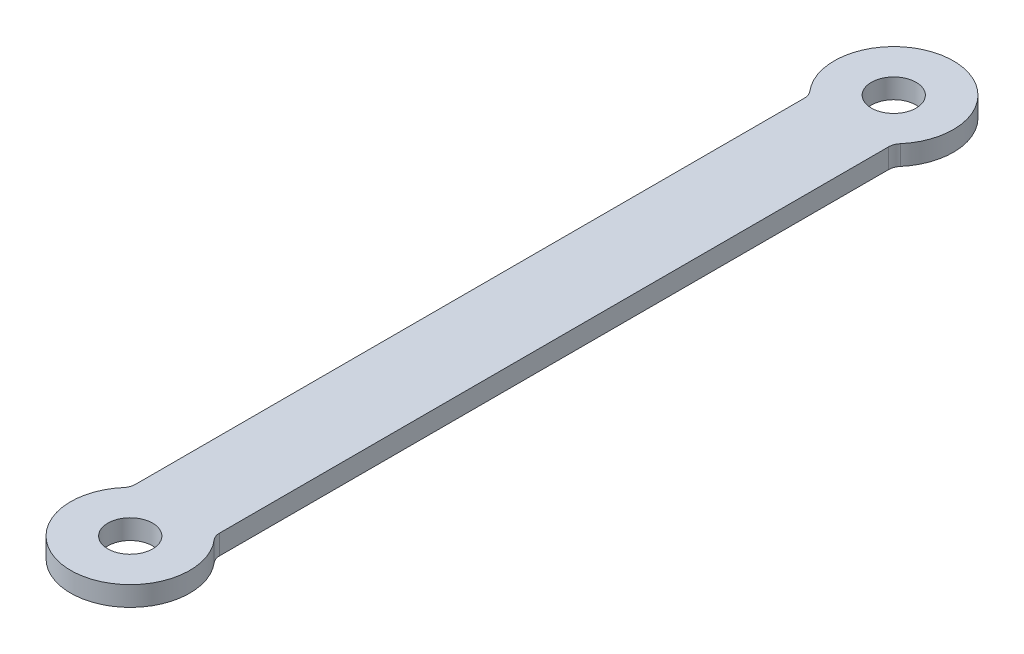
ISO-10303-21;
HEADER;
FILE_DESCRIPTION(('STEP AP214'),'2;1');
FILE_NAME('part.step','',(''),(''),'','','');
FILE_SCHEMA(('AUTOMOTIVE_DESIGN { 1 0 10303 214 1 1 1 1 }'));
ENDSEC;
DATA;
#1=APPLICATION_CONTEXT('core data for automotive mechanical design processes');
#2=APPLICATION_PROTOCOL_DEFINITION('international standard','automotive_design',2000,#1);
#3=PRODUCT_CONTEXT('',#1,'mechanical');
#4=PRODUCT('Part','Part','',(#3));
#5=PRODUCT_RELATED_PRODUCT_CATEGORY('part','',(#4));
#6=PRODUCT_DEFINITION_FORMATION('','',#4);
#7=PRODUCT_DEFINITION_CONTEXT('part definition',#1,'design');
#8=PRODUCT_DEFINITION('design','',#6,#7);
#9=PRODUCT_DEFINITION_SHAPE('','',#8);
#10=(LENGTH_UNIT() NAMED_UNIT(*) SI_UNIT(.MILLI.,.METRE.));
#11=(NAMED_UNIT(*) PLANE_ANGLE_UNIT() SI_UNIT($,.RADIAN.));
#12=(NAMED_UNIT(*) SI_UNIT($,.STERADIAN.) SOLID_ANGLE_UNIT());
#13=UNCERTAINTY_MEASURE_WITH_UNIT(LENGTH_MEASURE(1.E-05),#10,'distance_accuracy_value','');
#14=(GEOMETRIC_REPRESENTATION_CONTEXT(3) GLOBAL_UNCERTAINTY_ASSIGNED_CONTEXT((#13)) GLOBAL_UNIT_ASSIGNED_CONTEXT((#10,
#11,#12)) REPRESENTATION_CONTEXT('',''));
#15=CARTESIAN_POINT('',(0.,0.,0.));
#16=DIRECTION('',(0.,0.,1.));
#17=DIRECTION('',(1.,0.,0.));
#18=AXIS2_PLACEMENT_3D('',#15,#16,#17);
#19=CARTESIAN_POINT('',(0.,1.5,29.));
#20=DIRECTION('',(0.,-1.,0.));
#21=DIRECTION('',(0.,0.,-1.));
#22=AXIS2_PLACEMENT_3D('',#19,#20,#21);
#23=CYLINDRICAL_SURFACE('',#22,4.525);
#24=CARTESIAN_POINT('',(0.,1.5,29.));
#25=DIRECTION('',(0.,1.,0.));
#26=DIRECTION('',(0.,0.,1.));
#27=AXIS2_PLACEMENT_3D('',#24,#25,#26);
#28=CIRCLE('',#27,4.525);
#29=CARTESIAN_POINT('',(-3.43953905638603,1.5,26.0597285704216));
#30=VERTEX_POINT('',#29);
#31=CARTESIAN_POINT('',(3.43953905638603,1.5,26.0597285704216));
#32=VERTEX_POINT('',#31);
#33=EDGE_CURVE('E134',#30,#32,#28,.T.);
#34=ORIENTED_EDGE('',*,*,#33,.F.);
#35=DIRECTION('',(0.,-1.,0.));
#36=VECTOR('',#35,1.);
#37=CARTESIAN_POINT('',(-3.43953905638603,1.5,26.0597285704216));
#38=LINE('',#37,#36);
#39=CARTESIAN_POINT('',(-3.43953905638603,0.,26.0597285704216));
#40=VERTEX_POINT('',#39);
#41=EDGE_CURVE('E149',#30,#40,#38,.T.);
#42=ORIENTED_EDGE('',*,*,#41,.T.);
#43=CARTESIAN_POINT('',(0.,0.,29.));
#44=DIRECTION('',(0.,1.,0.));
#45=DIRECTION('',(0.,0.,1.));
#46=AXIS2_PLACEMENT_3D('',#43,#44,#45);
#47=CIRCLE('',#46,4.525);
#48=CARTESIAN_POINT('',(3.43953905638603,0.,26.0597285704216));
#49=VERTEX_POINT('',#48);
#50=EDGE_CURVE('E166',#40,#49,#47,.T.);
#51=ORIENTED_EDGE('',*,*,#50,.T.);
#52=DIRECTION('',(0.,-1.,0.));
#53=VECTOR('',#52,1.);
#54=CARTESIAN_POINT('',(3.43953905638603,1.5,26.0597285704216));
#55=LINE('',#54,#53);
#56=EDGE_CURVE('E147',#49,#32,#55,.F.);
#57=ORIENTED_EDGE('',*,*,#56,.T.);
#58=EDGE_LOOP('',(#34,#42,#51,#57));
#59=FACE_BOUND('',#58,.T.);
#60=ADVANCED_FACE('F41',(#59),#23,.T.);
#61=CARTESIAN_POINT('',(3.19965818486913,1.5,0.));
#62=DIRECTION('',(1.,0.,0.));
#63=DIRECTION('',(0.,0.,-1.));
#64=AXIS2_PLACEMENT_3D('',#61,#62,#63);
#65=PLANE('',#64);
#66=DIRECTION('',(0.,0.,1.));
#67=VECTOR('',#66,1.);
#68=CARTESIAN_POINT('',(3.19965818486913,1.5,0.));
#69=LINE('',#68,#67);
#70=CARTESIAN_POINT('',(3.19965818486913,1.5,-25.4099448290783));
#71=VERTEX_POINT('',#70);
#72=CARTESIAN_POINT('',(3.19965818486914,1.5,25.4099448290783));
#73=VERTEX_POINT('',#72);
#74=EDGE_CURVE('E137',#71,#73,#69,.T.);
#75=ORIENTED_EDGE('',*,*,#74,.T.);
#76=DIRECTION('',(0.,-1.,0.));
#77=VECTOR('',#76,1.);
#78=CARTESIAN_POINT('',(3.19965818486914,1.5,25.4099448290783));
#79=LINE('',#78,#77);
#80=CARTESIAN_POINT('',(3.19965818486914,0.,25.4099448290783));
#81=VERTEX_POINT('',#80);
#82=EDGE_CURVE('E118',#73,#81,#79,.T.);
#83=ORIENTED_EDGE('',*,*,#82,.T.);
#84=DIRECTION('',(0.,0.,1.));
#85=VECTOR('',#84,1.);
#86=CARTESIAN_POINT('',(3.19965818486913,0.,0.));
#87=LINE('',#86,#85);
#88=CARTESIAN_POINT('',(3.19965818486913,0.,-25.4099448290783));
#89=VERTEX_POINT('',#88);
#90=EDGE_CURVE('E139',#89,#81,#87,.T.);
#91=ORIENTED_EDGE('',*,*,#90,.F.);
#92=DIRECTION('',(0.,-1.,0.));
#93=VECTOR('',#92,1.);
#94=CARTESIAN_POINT('',(3.19965818486913,1.5,-25.4099448290783));
#95=LINE('',#94,#93);
#96=EDGE_CURVE('E63',#89,#71,#95,.F.);
#97=ORIENTED_EDGE('',*,*,#96,.T.);
#98=EDGE_LOOP('',(#75,#83,#91,#97));
#99=FACE_BOUND('',#98,.T.);
#100=ADVANCED_FACE('F164',(#99),#65,.T.);
#101=CARTESIAN_POINT('',(0.,1.5,-29.));
#102=DIRECTION('',(0.,-1.,0.));
#103=DIRECTION('',(0.,0.,-1.));
#104=AXIS2_PLACEMENT_3D('',#101,#102,#103);
#105=CYLINDRICAL_SURFACE('',#104,4.525);
#106=CARTESIAN_POINT('',(0.,0.,-29.));
#107=DIRECTION('',(0.,1.,0.));
#108=DIRECTION('',(0.,0.,1.));
#109=AXIS2_PLACEMENT_3D('',#106,#107,#108);
#110=CIRCLE('',#109,4.525);
#111=CARTESIAN_POINT('',(3.43953905638603,0.,-26.0597285704216));
#112=VERTEX_POINT('',#111);
#113=CARTESIAN_POINT('',(-3.43953905638603,0.,-26.0597285704216));
#114=VERTEX_POINT('',#113);
#115=EDGE_CURVE('E135',#112,#114,#110,.T.);
#116=ORIENTED_EDGE('',*,*,#115,.T.);
#117=DIRECTION('',(0.,-1.,0.));
#118=VECTOR('',#117,1.);
#119=CARTESIAN_POINT('',(-3.43953905638603,1.5,-26.0597285704216));
#120=LINE('',#119,#118);
#121=CARTESIAN_POINT('',(-3.43953905638603,1.5,-26.0597285704216));
#122=VERTEX_POINT('',#121);
#123=EDGE_CURVE('E112',#114,#122,#120,.F.);
#124=ORIENTED_EDGE('',*,*,#123,.T.);
#125=CARTESIAN_POINT('',(0.,1.5,-29.));
#126=DIRECTION('',(0.,1.,0.));
#127=DIRECTION('',(0.,0.,1.));
#128=AXIS2_PLACEMENT_3D('',#125,#126,#127);
#129=CIRCLE('',#128,4.525);
#130=CARTESIAN_POINT('',(3.43953905638603,1.5,-26.0597285704216));
#131=VERTEX_POINT('',#130);
#132=EDGE_CURVE('E171',#131,#122,#129,.T.);
#133=ORIENTED_EDGE('',*,*,#132,.F.);
#134=DIRECTION('',(0.,-1.,0.));
#135=VECTOR('',#134,1.);
#136=CARTESIAN_POINT('',(3.43953905638603,1.5,-26.0597285704216));
#137=LINE('',#136,#135);
#138=EDGE_CURVE('E128',#131,#112,#137,.T.);
#139=ORIENTED_EDGE('',*,*,#138,.T.);
#140=EDGE_LOOP('',(#116,#124,#133,#139));
#141=FACE_BOUND('',#140,.T.);
#142=ADVANCED_FACE('F173',(#141),#105,.T.);
#143=CARTESIAN_POINT('',(-3.19965818486914,1.5,0.));
#144=DIRECTION('',(1.,0.,0.));
#145=DIRECTION('',(0.,0.,-1.));
#146=AXIS2_PLACEMENT_3D('',#143,#144,#145);
#147=PLANE('',#146);
#148=DIRECTION('',(0.,0.,1.));
#149=VECTOR('',#148,1.);
#150=CARTESIAN_POINT('',(-3.19965818486914,1.5,0.));
#151=LINE('',#150,#149);
#152=CARTESIAN_POINT('',(-3.19965818486914,1.5,-25.4099448290783));
#153=VERTEX_POINT('',#152);
#154=CARTESIAN_POINT('',(-3.19965818486914,1.5,25.4099448290783));
#155=VERTEX_POINT('',#154);
#156=EDGE_CURVE('E127',#153,#155,#151,.T.);
#157=ORIENTED_EDGE('',*,*,#156,.F.);
#158=DIRECTION('',(0.,1.,0.));
#159=VECTOR('',#158,1.);
#160=CARTESIAN_POINT('',(-3.19965818486914,0.,-25.4099448290783));
#161=LINE('',#160,#159);
#162=CARTESIAN_POINT('',(-3.19965818486914,0.,-25.4099448290783));
#163=VERTEX_POINT('',#162);
#164=EDGE_CURVE('E111',#153,#163,#161,.F.);
#165=ORIENTED_EDGE('',*,*,#164,.T.);
#166=DIRECTION('',(0.,0.,1.));
#167=VECTOR('',#166,1.);
#168=CARTESIAN_POINT('',(-3.19965818486914,0.,0.));
#169=LINE('',#168,#167);
#170=CARTESIAN_POINT('',(-3.19965818486914,0.,25.4099448290783));
#171=VERTEX_POINT('',#170);
#172=EDGE_CURVE('E124',#163,#171,#169,.T.);
#173=ORIENTED_EDGE('',*,*,#172,.T.);
#174=DIRECTION('',(0.,1.,0.));
#175=VECTOR('',#174,1.);
#176=CARTESIAN_POINT('',(-3.19965818486914,1.5,25.4099448290783));
#177=LINE('',#176,#175);
#178=EDGE_CURVE('E129',#171,#155,#177,.T.);
#179=ORIENTED_EDGE('',*,*,#178,.T.);
#180=EDGE_LOOP('',(#157,#165,#173,#179));
#181=FACE_BOUND('',#180,.T.);
#182=ADVANCED_FACE('F123',(#181),#147,.F.);
#183=CARTESIAN_POINT('',(0.,1.5,0.));
#184=DIRECTION('',(0.,1.,0.));
#185=DIRECTION('',(0.,0.,1.));
#186=AXIS2_PLACEMENT_3D('',#183,#184,#185);
#187=PLANE('',#186);
#188=CARTESIAN_POINT('',(0.,1.5,-29.));
#189=DIRECTION('',(0.,1.,0.));
#190=DIRECTION('',(0.,0.,1.));
#191=AXIS2_PLACEMENT_3D('',#188,#189,#190);
#192=CIRCLE('',#191,1.7);
#193=CARTESIAN_POINT('',(0.,1.5,-27.3));
#194=VERTEX_POINT('',#193);
#195=EDGE_CURVE('E193',#194,#194,#192,.T.);
#196=ORIENTED_EDGE('',*,*,#195,.F.);
#197=EDGE_LOOP('',(#196));
#198=FACE_BOUND('',#197,.T.);
#199=CARTESIAN_POINT('',(0.,1.5,29.));
#200=DIRECTION('',(0.,1.,0.));
#201=DIRECTION('',(0.,0.,1.));
#202=AXIS2_PLACEMENT_3D('',#199,#200,#201);
#203=CIRCLE('',#202,1.7);
#204=CARTESIAN_POINT('',(0.,1.5,30.7));
#205=VERTEX_POINT('',#204);
#206=EDGE_CURVE('E183',#205,#205,#203,.T.);
#207=ORIENTED_EDGE('',*,*,#206,.F.);
#208=EDGE_LOOP('',(#207));
#209=FACE_BOUND('',#208,.T.);
#210=ORIENTED_EDGE('',*,*,#156,.T.);
#211=CARTESIAN_POINT('',(-4.19965818486913,1.5,25.4099448290783));
#212=DIRECTION('',(0.,1.,0.));
#213=DIRECTION('',(0.,0.,1.));
#214=AXIS2_PLACEMENT_3D('',#211,#212,#213);
#215=CIRCLE('',#214,1.);
#216=EDGE_CURVE('E157',#155,#30,#215,.F.);
#217=ORIENTED_EDGE('',*,*,#216,.T.);
#218=ORIENTED_EDGE('',*,*,#33,.T.);
#219=CARTESIAN_POINT('',(4.19965818486913,1.5,25.4099448290783));
#220=DIRECTION('',(0.,1.,0.));
#221=DIRECTION('',(0.,0.,1.));
#222=AXIS2_PLACEMENT_3D('',#219,#220,#221);
#223=CIRCLE('',#222,1.);
#224=EDGE_CURVE('E56',#32,#73,#223,.F.);
#225=ORIENTED_EDGE('',*,*,#224,.T.);
#226=ORIENTED_EDGE('',*,*,#74,.F.);
#227=CARTESIAN_POINT('',(4.19965818486913,1.5,-25.4099448290783));
#228=DIRECTION('',(0.,1.,0.));
#229=DIRECTION('',(0.,0.,1.));
#230=AXIS2_PLACEMENT_3D('',#227,#228,#229);
#231=CIRCLE('',#230,1.);
#232=EDGE_CURVE('E11',#71,#131,#231,.F.);
#233=ORIENTED_EDGE('',*,*,#232,.T.);
#234=ORIENTED_EDGE('',*,*,#132,.T.);
#235=CARTESIAN_POINT('',(-4.19965818486913,1.5,-25.4099448290783));
#236=DIRECTION('',(0.,1.,0.));
#237=DIRECTION('',(0.,0.,1.));
#238=AXIS2_PLACEMENT_3D('',#235,#236,#237);
#239=CIRCLE('',#238,1.);
#240=EDGE_CURVE('E117',#122,#153,#239,.F.);
#241=ORIENTED_EDGE('',*,*,#240,.T.);
#242=EDGE_LOOP('',(#210,#217,#218,#225,#226,#233,#234,#241));
#243=FACE_BOUND('',#242,.T.);
#244=ADVANCED_FACE('F170',(#198,#209,#243),#187,.T.);
#245=CARTESIAN_POINT('',(0.,0.,0.));
#246=DIRECTION('',(0.,1.,0.));
#247=DIRECTION('',(0.,0.,1.));
#248=AXIS2_PLACEMENT_3D('',#245,#246,#247);
#249=PLANE('',#248);
#250=CARTESIAN_POINT('',(0.,0.,-29.));
#251=DIRECTION('',(0.,1.,0.));
#252=DIRECTION('',(0.,0.,1.));
#253=AXIS2_PLACEMENT_3D('',#250,#251,#252);
#254=CIRCLE('',#253,1.7);
#255=CARTESIAN_POINT('',(0.,0.,-27.3));
#256=VERTEX_POINT('',#255);
#257=EDGE_CURVE('E188',#256,#256,#254,.T.);
#258=ORIENTED_EDGE('',*,*,#257,.T.);
#259=EDGE_LOOP('',(#258));
#260=FACE_BOUND('',#259,.T.);
#261=CARTESIAN_POINT('',(0.,0.,29.));
#262=DIRECTION('',(0.,1.,0.));
#263=DIRECTION('',(0.,0.,1.));
#264=AXIS2_PLACEMENT_3D('',#261,#262,#263);
#265=CIRCLE('',#264,1.7);
#266=CARTESIAN_POINT('',(0.,0.,30.7));
#267=VERTEX_POINT('',#266);
#268=EDGE_CURVE('E179',#267,#267,#265,.T.);
#269=ORIENTED_EDGE('',*,*,#268,.T.);
#270=EDGE_LOOP('',(#269));
#271=FACE_BOUND('',#270,.T.);
#272=ORIENTED_EDGE('',*,*,#50,.F.);
#273=CARTESIAN_POINT('',(-4.19965818486913,0.,25.4099448290783));
#274=DIRECTION('',(0.,1.,0.));
#275=DIRECTION('',(0.,0.,1.));
#276=AXIS2_PLACEMENT_3D('',#273,#274,#275);
#277=CIRCLE('',#276,1.);
#278=EDGE_CURVE('E133',#40,#171,#277,.T.);
#279=ORIENTED_EDGE('',*,*,#278,.T.);
#280=ORIENTED_EDGE('',*,*,#172,.F.);
#281=CARTESIAN_POINT('',(-4.19965818486913,0.,-25.4099448290783));
#282=DIRECTION('',(0.,1.,0.));
#283=DIRECTION('',(0.,0.,1.));
#284=AXIS2_PLACEMENT_3D('',#281,#282,#283);
#285=CIRCLE('',#284,1.);
#286=EDGE_CURVE('E107',#163,#114,#285,.T.);
#287=ORIENTED_EDGE('',*,*,#286,.T.);
#288=ORIENTED_EDGE('',*,*,#115,.F.);
#289=CARTESIAN_POINT('',(4.19965818486913,0.,-25.4099448290783));
#290=DIRECTION('',(0.,1.,0.));
#291=DIRECTION('',(0.,0.,1.));
#292=AXIS2_PLACEMENT_3D('',#289,#290,#291);
#293=CIRCLE('',#292,1.);
#294=EDGE_CURVE('E49',#112,#89,#293,.T.);
#295=ORIENTED_EDGE('',*,*,#294,.T.);
#296=ORIENTED_EDGE('',*,*,#90,.T.);
#297=CARTESIAN_POINT('',(4.19965818486913,0.,25.4099448290783));
#298=DIRECTION('',(0.,1.,0.));
#299=DIRECTION('',(0.,0.,1.));
#300=AXIS2_PLACEMENT_3D('',#297,#298,#299);
#301=CIRCLE('',#300,1.);
#302=EDGE_CURVE('E159',#81,#49,#301,.T.);
#303=ORIENTED_EDGE('',*,*,#302,.T.);
#304=EDGE_LOOP('',(#272,#279,#280,#287,#288,#295,#296,#303));
#305=FACE_BOUND('',#304,.T.);
#306=ADVANCED_FACE('F132',(#260,#271,#305),#249,.F.);
#307=CARTESIAN_POINT('',(0.,1.5,29.));
#308=DIRECTION('',(0.,1.,0.));
#309=DIRECTION('',(0.,0.,1.));
#310=AXIS2_PLACEMENT_3D('',#307,#308,#309);
#311=CYLINDRICAL_SURFACE('',#310,1.7);
#312=ORIENTED_EDGE('',*,*,#268,.F.);
#313=EDGE_LOOP('',(#312));
#314=FACE_BOUND('',#313,.T.);
#315=ORIENTED_EDGE('',*,*,#206,.T.);
#316=EDGE_LOOP('',(#315));
#317=FACE_BOUND('',#316,.T.);
#318=ADVANCED_FACE('F204',(#314,#317),#311,.F.);
#319=CARTESIAN_POINT('',(0.,1.5,-29.));
#320=DIRECTION('',(0.,1.,0.));
#321=DIRECTION('',(0.,0.,1.));
#322=AXIS2_PLACEMENT_3D('',#319,#320,#321);
#323=CYLINDRICAL_SURFACE('',#322,1.7);
#324=ORIENTED_EDGE('',*,*,#257,.F.);
#325=EDGE_LOOP('',(#324));
#326=FACE_BOUND('',#325,.T.);
#327=ORIENTED_EDGE('',*,*,#195,.T.);
#328=EDGE_LOOP('',(#327));
#329=FACE_BOUND('',#328,.T.);
#330=ADVANCED_FACE('F197',(#326,#329),#323,.F.);
#331=CARTESIAN_POINT('',(-4.19965818486913,1.5,-25.4099448290783));
#332=DIRECTION('',(0.,-1.,0.));
#333=DIRECTION('',(0.,0.,-1.));
#334=AXIS2_PLACEMENT_3D('',#331,#332,#333);
#335=CYLINDRICAL_SURFACE('',#334,1.);
#336=ORIENTED_EDGE('',*,*,#240,.F.);
#337=ORIENTED_EDGE('',*,*,#123,.F.);
#338=ORIENTED_EDGE('',*,*,#286,.F.);
#339=ORIENTED_EDGE('',*,*,#164,.F.);
#340=EDGE_LOOP('',(#336,#337,#338,#339));
#341=FACE_BOUND('',#340,.T.);
#342=ADVANCED_FACE('F110',(#341),#335,.F.);
#343=CARTESIAN_POINT('',(-4.19965818486913,1.5,25.4099448290783));
#344=DIRECTION('',(0.,-1.,0.));
#345=DIRECTION('',(0.,0.,-1.));
#346=AXIS2_PLACEMENT_3D('',#343,#344,#345);
#347=CYLINDRICAL_SURFACE('',#346,1.);
#348=ORIENTED_EDGE('',*,*,#216,.F.);
#349=ORIENTED_EDGE('',*,*,#178,.F.);
#350=ORIENTED_EDGE('',*,*,#278,.F.);
#351=ORIENTED_EDGE('',*,*,#41,.F.);
#352=EDGE_LOOP('',(#348,#349,#350,#351));
#353=FACE_BOUND('',#352,.T.);
#354=ADVANCED_FACE('F227',(#353),#347,.F.);
#355=CARTESIAN_POINT('',(4.19965818486913,1.5,25.4099448290783));
#356=DIRECTION('',(0.,-1.,0.));
#357=DIRECTION('',(0.,0.,-1.));
#358=AXIS2_PLACEMENT_3D('',#355,#356,#357);
#359=CYLINDRICAL_SURFACE('',#358,1.);
#360=ORIENTED_EDGE('',*,*,#224,.F.);
#361=ORIENTED_EDGE('',*,*,#56,.F.);
#362=ORIENTED_EDGE('',*,*,#302,.F.);
#363=ORIENTED_EDGE('',*,*,#82,.F.);
#364=EDGE_LOOP('',(#360,#361,#362,#363));
#365=FACE_BOUND('',#364,.T.);
#366=ADVANCED_FACE('F229',(#365),#359,.F.);
#367=CARTESIAN_POINT('',(4.19965818486913,1.5,-25.4099448290783));
#368=DIRECTION('',(0.,-1.,0.));
#369=DIRECTION('',(0.,0.,-1.));
#370=AXIS2_PLACEMENT_3D('',#367,#368,#369);
#371=CYLINDRICAL_SURFACE('',#370,1.);
#372=ORIENTED_EDGE('',*,*,#232,.F.);
#373=ORIENTED_EDGE('',*,*,#96,.F.);
#374=ORIENTED_EDGE('',*,*,#294,.F.);
#375=ORIENTED_EDGE('',*,*,#138,.F.);
#376=EDGE_LOOP('',(#372,#373,#374,#375));
#377=FACE_BOUND('',#376,.T.);
#378=ADVANCED_FACE('F43',(#377),#371,.F.);
#379=CLOSED_SHELL('',(#60,#100,#142,#182,#244,#306,#318,#330,#342,#354,#366,#378));
#380=MANIFOLD_SOLID_BREP('B2',#379);
#381=ADVANCED_BREP_SHAPE_REPRESENTATION('',(#18,#380),#14);
#382=SHAPE_DEFINITION_REPRESENTATION(#9,#381);
ENDSEC;
END-ISO-10303-21;
